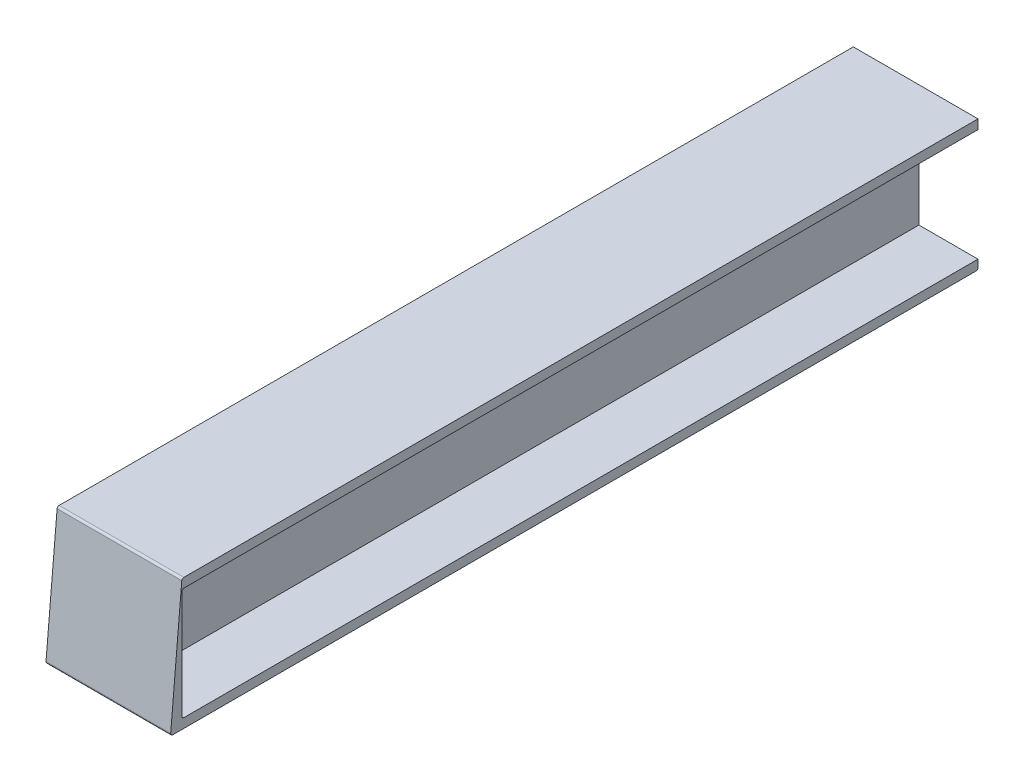
ISO-10303-21;
HEADER;
FILE_DESCRIPTION(('STEP AP214'),'2;1');
FILE_NAME('part.step','',(''),(''),'','','');
FILE_SCHEMA(('AUTOMOTIVE_DESIGN { 1 0 10303 214 1 1 1 1 }'));
ENDSEC;
DATA;
#1=APPLICATION_CONTEXT('core data for automotive mechanical design processes');
#2=APPLICATION_PROTOCOL_DEFINITION('international standard','automotive_design',2000,#1);
#3=PRODUCT_CONTEXT('',#1,'mechanical');
#4=PRODUCT('Part','Part','',(#3));
#5=PRODUCT_RELATED_PRODUCT_CATEGORY('part','',(#4));
#6=PRODUCT_DEFINITION_FORMATION('','',#4);
#7=PRODUCT_DEFINITION_CONTEXT('part definition',#1,'design');
#8=PRODUCT_DEFINITION('design','',#6,#7);
#9=PRODUCT_DEFINITION_SHAPE('','',#8);
#10=(LENGTH_UNIT() NAMED_UNIT(*) SI_UNIT(.MILLI.,.METRE.));
#11=(NAMED_UNIT(*) PLANE_ANGLE_UNIT() SI_UNIT($,.RADIAN.));
#12=(NAMED_UNIT(*) SI_UNIT($,.STERADIAN.) SOLID_ANGLE_UNIT());
#13=UNCERTAINTY_MEASURE_WITH_UNIT(LENGTH_MEASURE(1.E-05),#10,'distance_accuracy_value','');
#14=(GEOMETRIC_REPRESENTATION_CONTEXT(3) GLOBAL_UNCERTAINTY_ASSIGNED_CONTEXT((#13)) GLOBAL_UNIT_ASSIGNED_CONTEXT((#10,
#11,#12)) REPRESENTATION_CONTEXT('',''));
#15=CARTESIAN_POINT('',(0.,0.,0.));
#16=DIRECTION('',(0.,0.,1.));
#17=DIRECTION('',(1.,0.,0.));
#18=AXIS2_PLACEMENT_3D('',#15,#16,#17);
#19=CARTESIAN_POINT('',(73.152,-11.5572405329581,900.));
#20=DIRECTION('',(0.,1.,0.));
#21=DIRECTION('',(-1.,0.,0.));
#22=AXIS2_PLACEMENT_3D('',#19,#20,#21);
#23=PLANE('',#22);
#24=DIRECTION('',(0.,0.,-1.));
#25=VECTOR('',#24,1.);
#26=CARTESIAN_POINT('',(73.152,-11.5572405329581,900.));
#27=LINE('',#26,#25);
#28=CARTESIAN_POINT('',(73.152,-11.5572405329581,897.46));
#29=VERTEX_POINT('',#28);
#30=CARTESIAN_POINT('',(73.152,-11.5572405329581,-86.0122870923226));
#31=VERTEX_POINT('',#30);
#32=EDGE_CURVE('E176',#29,#31,#27,.T.);
#33=ORIENTED_EDGE('',*,*,#32,.F.);
#34=DIRECTION('',(1.,0.,0.));
#35=VECTOR('',#34,1.);
#36=CARTESIAN_POINT('',(0.,-11.5572405329582,897.46));
#37=LINE('',#36,#35);
#38=CARTESIAN_POINT('',(0.,-11.5572405329582,897.46));
#39=VERTEX_POINT('',#38);
#40=EDGE_CURVE('E296',#29,#39,#37,.F.);
#41=ORIENTED_EDGE('',*,*,#40,.T.);
#42=DIRECTION('',(0.,0.,-1.));
#43=VECTOR('',#42,1.);
#44=CARTESIAN_POINT('',(0.,-11.5572405329582,900.));
#45=LINE('',#44,#43);
#46=CARTESIAN_POINT('',(0.,-11.5572405329582,-86.0122870923226));
#47=VERTEX_POINT('',#46);
#48=EDGE_CURVE('E254',#39,#47,#45,.T.);
#49=ORIENTED_EDGE('',*,*,#48,.T.);
#50=DIRECTION('',(-1.,0.,0.));
#51=VECTOR('',#50,1.);
#52=CARTESIAN_POINT('',(73.152,-11.5572405329581,-86.0122870923226));
#53=LINE('',#52,#51);
#54=EDGE_CURVE('E187',#31,#47,#53,.T.);
#55=ORIENTED_EDGE('',*,*,#54,.F.);
#56=EDGE_LOOP('',(#33,#41,#49,#55));
#57=FACE_BOUND('',#56,.T.);
#58=ADVANCED_FACE('F35',(#57),#23,.F.);
#59=CARTESIAN_POINT('',(73.152,-150.495240532958,900.));
#60=DIRECTION('',(1.,0.,0.));
#61=DIRECTION('',(0.,0.,-1.));
#62=AXIS2_PLACEMENT_3D('',#59,#60,#61);
#63=PLANE('',#62);
#64=DIRECTION('',(0.,-1.,0.));
#65=VECTOR('',#64,1.);
#66=CARTESIAN_POINT('',(73.152,-150.495240532958,900.));
#67=LINE('',#66,#65);
#68=CARTESIAN_POINT('',(73.152,-14.0972405329582,900.));
#69=VERTEX_POINT('',#68);
#70=CARTESIAN_POINT('',(73.152,-147.955240532958,900.));
#71=VERTEX_POINT('',#70);
#72=EDGE_CURVE('E230',#69,#71,#67,.T.);
#73=ORIENTED_EDGE('',*,*,#72,.F.);
#74=CARTESIAN_POINT('',(73.152,-14.0972405329581,897.46));
#75=DIRECTION('',(1.,0.,0.));
#76=DIRECTION('',(0.,0.,-1.));
#77=AXIS2_PLACEMENT_3D('',#74,#75,#76);
#78=CIRCLE('',#77,2.54);
#79=EDGE_CURVE('E294',#69,#29,#78,.F.);
#80=ORIENTED_EDGE('',*,*,#79,.T.);
#81=ORIENTED_EDGE('',*,*,#32,.T.);
#82=DIRECTION('',(0.,1.,0.));
#83=VECTOR('',#82,1.);
#84=CARTESIAN_POINT('',(73.152,-150.495240532958,-86.0122870923226));
#85=LINE('',#84,#83);
#86=CARTESIAN_POINT('',(73.152,-150.495240532958,-86.0122870923226));
#87=VERTEX_POINT('',#86);
#88=EDGE_CURVE('E180',#87,#31,#85,.T.);
#89=ORIENTED_EDGE('',*,*,#88,.F.);
#90=DIRECTION('',(0.,0.,-1.));
#91=VECTOR('',#90,1.);
#92=CARTESIAN_POINT('',(73.152,-150.495240532958,900.));
#93=LINE('',#92,#91);
#94=CARTESIAN_POINT('',(73.152,-150.495240532958,897.46));
#95=VERTEX_POINT('',#94);
#96=EDGE_CURVE('E166',#95,#87,#93,.T.);
#97=ORIENTED_EDGE('',*,*,#96,.F.);
#98=CARTESIAN_POINT('',(73.152,-147.955240532958,897.46));
#99=DIRECTION('',(1.,0.,0.));
#100=DIRECTION('',(0.,0.,-1.));
#101=AXIS2_PLACEMENT_3D('',#98,#99,#100);
#102=CIRCLE('',#101,2.54);
#103=EDGE_CURVE('E292',#95,#71,#102,.F.);
#104=ORIENTED_EDGE('',*,*,#103,.T.);
#105=EDGE_LOOP('',(#73,#80,#81,#89,#97,#104));
#106=FACE_BOUND('',#105,.T.);
#107=ADVANCED_FACE('F182',(#106),#63,.F.);
#108=CARTESIAN_POINT('',(0.,-150.495240532958,900.));
#109=DIRECTION('',(0.,-1.,0.));
#110=DIRECTION('',(1.,0.,0.));
#111=AXIS2_PLACEMENT_3D('',#108,#109,#110);
#112=PLANE('',#111);
#113=DIRECTION('',(0.,0.,-1.));
#114=VECTOR('',#113,1.);
#115=CARTESIAN_POINT('',(0.,-150.495240532958,900.));
#116=LINE('',#115,#114);
#117=CARTESIAN_POINT('',(0.,-150.495240532958,897.46));
#118=VERTEX_POINT('',#117);
#119=CARTESIAN_POINT('',(0.,-150.495240532958,-86.0122870923226));
#120=VERTEX_POINT('',#119);
#121=EDGE_CURVE('E177',#118,#120,#116,.T.);
#122=ORIENTED_EDGE('',*,*,#121,.F.);
#123=DIRECTION('',(-1.,0.,0.));
#124=VECTOR('',#123,1.);
#125=CARTESIAN_POINT('',(73.152,-150.495240532958,897.46));
#126=LINE('',#125,#124);
#127=EDGE_CURVE('E173',#118,#95,#126,.F.);
#128=ORIENTED_EDGE('',*,*,#127,.T.);
#129=ORIENTED_EDGE('',*,*,#96,.T.);
#130=DIRECTION('',(1.,0.,0.));
#131=VECTOR('',#130,1.);
#132=CARTESIAN_POINT('',(0.,-150.495240532958,-86.0122870923226));
#133=LINE('',#132,#131);
#134=EDGE_CURVE('E171',#120,#87,#133,.T.);
#135=ORIENTED_EDGE('',*,*,#134,.F.);
#136=EDGE_LOOP('',(#122,#128,#129,#135));
#137=FACE_BOUND('',#136,.T.);
#138=ADVANCED_FACE('F169',(#137),#112,.F.);
#139=CARTESIAN_POINT('',(0.,-162.052240532958,900.));
#140=DIRECTION('',(1.,0.,0.));
#141=DIRECTION('',(0.,1.,0.));
#142=AXIS2_PLACEMENT_3D('',#139,#140,#141);
#143=PLANE('',#142);
#144=DIRECTION('',(0.,1.,0.));
#145=VECTOR('',#144,1.);
#146=CARTESIAN_POINT('',(0.,-162.052240532958,-86.0122870923226));
#147=LINE('',#146,#145);
#148=CARTESIAN_POINT('',(0.,-159.512240532958,-86.0122870923226));
#149=VERTEX_POINT('',#148);
#150=EDGE_CURVE('E192',#149,#120,#147,.T.);
#151=ORIENTED_EDGE('',*,*,#150,.F.);
#152=CARTESIAN_POINT('',(0.,-159.512240532958,-83.4722870923226));
#153=DIRECTION('',(1.,0.,0.));
#154=DIRECTION('',(0.,1.,0.));
#155=AXIS2_PLACEMENT_3D('',#152,#153,#154);
#156=CIRCLE('',#155,2.54);
#157=CARTESIAN_POINT('',(0.,-162.052240532958,-83.4722870923226));
#158=VERTEX_POINT('',#157);
#159=EDGE_CURVE('E57',#149,#158,#156,.F.);
#160=ORIENTED_EDGE('',*,*,#159,.T.);
#161=DIRECTION('',(0.,0.,-1.));
#162=VECTOR('',#161,1.);
#163=CARTESIAN_POINT('',(0.,-162.052240532958,900.));
#164=LINE('',#163,#162);
#165=CARTESIAN_POINT('',(0.,-162.052240532958,911.405789308986));
#166=VERTEX_POINT('',#165);
#167=EDGE_CURVE('E250',#166,#158,#164,.T.);
#168=ORIENTED_EDGE('',*,*,#167,.F.);
#169=CARTESIAN_POINT('',(0.,-159.512240532958,911.405789308986));
#170=DIRECTION('',(1.,0.,0.));
#171=DIRECTION('',(0.,1.,0.));
#172=AXIS2_PLACEMENT_3D('',#169,#170,#171);
#173=CIRCLE('',#172,2.54);
#174=CARTESIAN_POINT('',(0.,-159.290864946379,913.936123842139));
#175=VERTEX_POINT('',#174);
#176=EDGE_CURVE('E276',#166,#175,#173,.F.);
#177=ORIENTED_EDGE('',*,*,#176,.T.);
#178=DIRECTION('',(0.,0.996194698091746,-0.0871557427476519));
#179=VECTOR('',#178,1.);
#180=CARTESIAN_POINT('',(1.94289029309402E-13,-0.000240532958325138,900.));
#181=LINE('',#180,#179);
#182=CARTESIAN_POINT('',(1.91504796583308E-13,-2.31886494637912,900.202853351149));
#183=VERTEX_POINT('',#182);
#184=EDGE_CURVE('E224',#175,#183,#181,.T.);
#185=ORIENTED_EDGE('',*,*,#184,.T.);
#186=CARTESIAN_POINT('',(1.94289029309402E-13,-2.54024053295815,897.672518817996));
#187=DIRECTION('',(1.,0.,0.));
#188=DIRECTION('',(0.,1.,0.));
#189=AXIS2_PLACEMENT_3D('',#186,#187,#188);
#190=CIRCLE('',#189,2.54);
#191=CARTESIAN_POINT('',(0.,-0.000240532958150197,897.672518817996));
#192=VERTEX_POINT('',#191);
#193=EDGE_CURVE('E278',#183,#192,#190,.F.);
#194=ORIENTED_EDGE('',*,*,#193,.T.);
#195=DIRECTION('',(0.,0.,-1.));
#196=VECTOR('',#195,1.);
#197=CARTESIAN_POINT('',(0.,-0.000240532958150197,900.));
#198=LINE('',#197,#196);
#199=CARTESIAN_POINT('',(0.,-0.000240532958150197,-86.0122870923226));
#200=VERTEX_POINT('',#199);
#201=EDGE_CURVE('E236',#192,#200,#198,.T.);
#202=ORIENTED_EDGE('',*,*,#201,.T.);
#203=DIRECTION('',(0.,1.,0.));
#204=VECTOR('',#203,1.);
#205=CARTESIAN_POINT('',(0.,-11.5572405329582,-86.0122870923226));
#206=LINE('',#205,#204);
#207=EDGE_CURVE('E218',#47,#200,#206,.T.);
#208=ORIENTED_EDGE('',*,*,#207,.F.);
#209=ORIENTED_EDGE('',*,*,#48,.F.);
#210=CARTESIAN_POINT('',(1.66533453693773E-13,-14.0972405329582,897.46));
#211=DIRECTION('',(1.,0.,0.));
#212=DIRECTION('',(0.,1.,0.));
#213=AXIS2_PLACEMENT_3D('',#210,#211,#212);
#214=CIRCLE('',#213,2.54);
#215=CARTESIAN_POINT('',(1.77361178247123E-13,-14.0972405329582,900.));
#216=VERTEX_POINT('',#215);
#217=EDGE_CURVE('E305',#39,#216,#214,.T.);
#218=ORIENTED_EDGE('',*,*,#217,.T.);
#219=DIRECTION('',(0.,1.,0.));
#220=VECTOR('',#219,1.);
#221=CARTESIAN_POINT('',(1.94289029309402E-13,-0.000240532958326622,900.));
#222=LINE('',#221,#220);
#223=CARTESIAN_POINT('',(0.,-147.955240532958,900.));
#224=VERTEX_POINT('',#223);
#225=EDGE_CURVE('E222',#224,#216,#222,.T.);
#226=ORIENTED_EDGE('',*,*,#225,.F.);
#227=CARTESIAN_POINT('',(0.,-147.955240532958,897.46));
#228=DIRECTION('',(1.,0.,0.));
#229=DIRECTION('',(0.,1.,0.));
#230=AXIS2_PLACEMENT_3D('',#227,#228,#229);
#231=CIRCLE('',#230,2.54);
#232=EDGE_CURVE('E307',#224,#118,#231,.T.);
#233=ORIENTED_EDGE('',*,*,#232,.T.);
#234=ORIENTED_EDGE('',*,*,#121,.T.);
#235=EDGE_LOOP('',(#151,#160,#168,#177,#185,#194,#202,#208,#209,#218,#226,#233,#234));
#236=FACE_BOUND('',#235,.T.);
#237=ADVANCED_FACE('F315',(#236),#143,.F.);
#238=CARTESIAN_POINT('',(154.432,-162.052240532958,900.));
#239=DIRECTION('',(0.,1.,0.));
#240=DIRECTION('',(-1.,0.,0.));
#241=AXIS2_PLACEMENT_3D('',#238,#239,#240);
#242=PLANE('',#241);
#243=ORIENTED_EDGE('',*,*,#167,.T.);
#244=DIRECTION('',(-1.,0.,0.));
#245=VECTOR('',#244,1.);
#246=CARTESIAN_POINT('',(154.432,-162.052240532958,-83.4722870923226));
#247=LINE('',#246,#245);
#248=CARTESIAN_POINT('',(154.432,-162.052240532958,-83.4722870923226));
#249=VERTEX_POINT('',#248);
#250=EDGE_CURVE('E43',#158,#249,#247,.F.);
#251=ORIENTED_EDGE('',*,*,#250,.T.);
#252=DIRECTION('',(0.,0.,-1.));
#253=VECTOR('',#252,1.);
#254=CARTESIAN_POINT('',(154.432,-162.052240532958,900.));
#255=LINE('',#254,#253);
#256=CARTESIAN_POINT('',(154.432,-162.052240532958,911.405789308986));
#257=VERTEX_POINT('',#256);
#258=EDGE_CURVE('E248',#257,#249,#255,.T.);
#259=ORIENTED_EDGE('',*,*,#258,.F.);
#260=DIRECTION('',(1.,0.,0.));
#261=VECTOR('',#260,1.);
#262=CARTESIAN_POINT('',(0.,-162.052240532958,911.405789308986));
#263=LINE('',#262,#261);
#264=EDGE_CURVE('E299',#257,#166,#263,.F.);
#265=ORIENTED_EDGE('',*,*,#264,.T.);
#266=EDGE_LOOP('',(#243,#251,#259,#265));
#267=FACE_BOUND('',#266,.T.);
#268=ADVANCED_FACE('F405',(#267),#242,.F.);
#269=CARTESIAN_POINT('',(81.28,-150.495240532958,900.));
#270=DIRECTION('',(0.,-1.,0.));
#271=DIRECTION('',(1.,0.,0.));
#272=AXIS2_PLACEMENT_3D('',#269,#270,#271);
#273=PLANE('',#272);
#274=DIRECTION('',(0.,0.,-1.));
#275=VECTOR('',#274,1.);
#276=CARTESIAN_POINT('',(81.28,-150.495240532958,900.));
#277=LINE('',#276,#275);
#278=CARTESIAN_POINT('',(81.28,-150.495240532958,897.46));
#279=VERTEX_POINT('',#278);
#280=CARTESIAN_POINT('',(81.28,-150.495240532958,-86.0122870923226));
#281=VERTEX_POINT('',#280);
#282=EDGE_CURVE('E244',#279,#281,#277,.T.);
#283=ORIENTED_EDGE('',*,*,#282,.F.);
#284=DIRECTION('',(-1.,0.,0.));
#285=VECTOR('',#284,1.);
#286=CARTESIAN_POINT('',(154.432,-150.495240532958,897.46));
#287=LINE('',#286,#285);
#288=CARTESIAN_POINT('',(154.432,-150.495240532958,897.46));
#289=VERTEX_POINT('',#288);
#290=EDGE_CURVE('E268',#279,#289,#287,.F.);
#291=ORIENTED_EDGE('',*,*,#290,.T.);
#292=DIRECTION('',(0.,0.,-1.));
#293=VECTOR('',#292,1.);
#294=CARTESIAN_POINT('',(154.432,-150.495240532958,900.));
#295=LINE('',#294,#293);
#296=CARTESIAN_POINT('',(154.432,-150.495240532958,-86.0122870923226));
#297=VERTEX_POINT('',#296);
#298=EDGE_CURVE('E246',#289,#297,#295,.T.);
#299=ORIENTED_EDGE('',*,*,#298,.T.);
#300=DIRECTION('',(1.,0.,0.));
#301=VECTOR('',#300,1.);
#302=CARTESIAN_POINT('',(81.28,-150.495240532958,-86.0122870923226));
#303=LINE('',#302,#301);
#304=EDGE_CURVE('E203',#281,#297,#303,.T.);
#305=ORIENTED_EDGE('',*,*,#304,.F.);
#306=EDGE_LOOP('',(#283,#291,#299,#305));
#307=FACE_BOUND('',#306,.T.);
#308=ADVANCED_FACE('F355',(#307),#273,.F.);
#309=CARTESIAN_POINT('',(81.28,-11.5572405329582,900.));
#310=DIRECTION('',(-1.,0.,0.));
#311=DIRECTION('',(0.,-1.,0.));
#312=AXIS2_PLACEMENT_3D('',#309,#310,#311);
#313=PLANE('',#312);
#314=DIRECTION('',(0.,0.,-1.));
#315=VECTOR('',#314,1.);
#316=CARTESIAN_POINT('',(81.28,-11.5572405329582,900.));
#317=LINE('',#316,#315);
#318=CARTESIAN_POINT('',(81.28,-11.5572405329582,897.46));
#319=VERTEX_POINT('',#318);
#320=CARTESIAN_POINT('',(81.28,-11.5572405329582,-86.0122870923226));
#321=VERTEX_POINT('',#320);
#322=EDGE_CURVE('E242',#319,#321,#317,.T.);
#323=ORIENTED_EDGE('',*,*,#322,.F.);
#324=CARTESIAN_POINT('',(81.28,-14.0972405329582,897.46));
#325=DIRECTION('',(-1.,0.,0.));
#326=DIRECTION('',(0.,-1.,0.));
#327=AXIS2_PLACEMENT_3D('',#324,#325,#326);
#328=CIRCLE('',#327,2.54);
#329=CARTESIAN_POINT('',(81.28,-14.0972405329582,900.));
#330=VERTEX_POINT('',#329);
#331=EDGE_CURVE('E266',#319,#330,#328,.F.);
#332=ORIENTED_EDGE('',*,*,#331,.T.);
#333=DIRECTION('',(0.,1.,0.));
#334=VECTOR('',#333,1.);
#335=CARTESIAN_POINT('',(81.28,-11.5572405329582,900.));
#336=LINE('',#335,#334);
#337=CARTESIAN_POINT('',(81.28,-147.955240532958,900.));
#338=VERTEX_POINT('',#337);
#339=EDGE_CURVE('E233',#338,#330,#336,.T.);
#340=ORIENTED_EDGE('',*,*,#339,.F.);
#341=CARTESIAN_POINT('',(81.28,-147.955240532958,897.46));
#342=DIRECTION('',(-1.,0.,0.));
#343=DIRECTION('',(0.,-1.,0.));
#344=AXIS2_PLACEMENT_3D('',#341,#342,#343);
#345=CIRCLE('',#344,2.54);
#346=EDGE_CURVE('E264',#338,#279,#345,.F.);
#347=ORIENTED_EDGE('',*,*,#346,.T.);
#348=ORIENTED_EDGE('',*,*,#282,.T.);
#349=DIRECTION('',(0.,-1.,0.));
#350=VECTOR('',#349,1.);
#351=CARTESIAN_POINT('',(81.28,-11.5572405329582,-86.0122870923226));
#352=LINE('',#351,#350);
#353=EDGE_CURVE('E206',#321,#281,#352,.T.);
#354=ORIENTED_EDGE('',*,*,#353,.F.);
#355=EDGE_LOOP('',(#323,#332,#340,#347,#348,#354));
#356=FACE_BOUND('',#355,.T.);
#357=ADVANCED_FACE('F349',(#356),#313,.F.);
#358=CARTESIAN_POINT('',(154.432,-11.5572405329581,900.));
#359=DIRECTION('',(0.,1.,0.));
#360=DIRECTION('',(-1.,0.,0.));
#361=AXIS2_PLACEMENT_3D('',#358,#359,#360);
#362=PLANE('',#361);
#363=DIRECTION('',(0.,0.,-1.));
#364=VECTOR('',#363,1.);
#365=CARTESIAN_POINT('',(154.432,-11.5572405329581,900.));
#366=LINE('',#365,#364);
#367=CARTESIAN_POINT('',(154.432,-11.5572405329581,897.46));
#368=VERTEX_POINT('',#367);
#369=CARTESIAN_POINT('',(154.432,-11.5572405329581,-86.0122870923226));
#370=VERTEX_POINT('',#369);
#371=EDGE_CURVE('E240',#368,#370,#366,.T.);
#372=ORIENTED_EDGE('',*,*,#371,.F.);
#373=DIRECTION('',(1.,0.,0.));
#374=VECTOR('',#373,1.);
#375=CARTESIAN_POINT('',(81.28,-11.5572405329582,897.46));
#376=LINE('',#375,#374);
#377=EDGE_CURVE('E262',#368,#319,#376,.F.);
#378=ORIENTED_EDGE('',*,*,#377,.T.);
#379=ORIENTED_EDGE('',*,*,#322,.T.);
#380=DIRECTION('',(-1.,0.,0.));
#381=VECTOR('',#380,1.);
#382=CARTESIAN_POINT('',(154.432,-11.5572405329581,-86.0122870923226));
#383=LINE('',#382,#381);
#384=EDGE_CURVE('E209',#370,#321,#383,.T.);
#385=ORIENTED_EDGE('',*,*,#384,.F.);
#386=EDGE_LOOP('',(#372,#378,#379,#385));
#387=FACE_BOUND('',#386,.T.);
#388=ADVANCED_FACE('F344',(#387),#362,.F.);
#389=CARTESIAN_POINT('',(154.432,-0.000240532958131285,900.));
#390=DIRECTION('',(-1.,0.,0.));
#391=DIRECTION('',(0.,0.,1.));
#392=AXIS2_PLACEMENT_3D('',#389,#390,#391);
#393=PLANE('',#392);
#394=ORIENTED_EDGE('',*,*,#258,.T.);
#395=CARTESIAN_POINT('',(154.432,-159.512240532958,-83.4722870923226));
#396=DIRECTION('',(-1.,0.,0.));
#397=DIRECTION('',(0.,0.,1.));
#398=AXIS2_PLACEMENT_3D('',#395,#396,#397);
#399=CIRCLE('',#398,2.54);
#400=CARTESIAN_POINT('',(154.432,-159.512240532958,-86.0122870923226));
#401=VERTEX_POINT('',#400);
#402=EDGE_CURVE('E11',#249,#401,#399,.F.);
#403=ORIENTED_EDGE('',*,*,#402,.T.);
#404=DIRECTION('',(0.,-1.,0.));
#405=VECTOR('',#404,1.);
#406=CARTESIAN_POINT('',(154.432,-150.495240532958,-86.0122870923226));
#407=LINE('',#406,#405);
#408=EDGE_CURVE('E199',#297,#401,#407,.T.);
#409=ORIENTED_EDGE('',*,*,#408,.F.);
#410=ORIENTED_EDGE('',*,*,#298,.F.);
#411=CARTESIAN_POINT('',(154.432,-147.955240532958,897.46));
#412=DIRECTION('',(-1.,0.,0.));
#413=DIRECTION('',(0.,0.,1.));
#414=AXIS2_PLACEMENT_3D('',#411,#412,#413);
#415=CIRCLE('',#414,2.54);
#416=CARTESIAN_POINT('',(154.432,-147.955240532958,900.));
#417=VERTEX_POINT('',#416);
#418=EDGE_CURVE('E303',#289,#417,#415,.T.);
#419=ORIENTED_EDGE('',*,*,#418,.T.);
#420=DIRECTION('',(0.,-1.,0.));
#421=VECTOR('',#420,1.);
#422=CARTESIAN_POINT('',(154.432,-0.000240532958131285,900.));
#423=LINE('',#422,#421);
#424=CARTESIAN_POINT('',(154.432,-14.0972405329581,900.));
#425=VERTEX_POINT('',#424);
#426=EDGE_CURVE('E194',#425,#417,#423,.T.);
#427=ORIENTED_EDGE('',*,*,#426,.F.);
#428=CARTESIAN_POINT('',(154.432,-14.0972405329581,897.46));
#429=DIRECTION('',(-1.,0.,0.));
#430=DIRECTION('',(0.,0.,1.));
#431=AXIS2_PLACEMENT_3D('',#428,#429,#430);
#432=CIRCLE('',#431,2.54);
#433=EDGE_CURVE('E301',#425,#368,#432,.T.);
#434=ORIENTED_EDGE('',*,*,#433,.T.);
#435=ORIENTED_EDGE('',*,*,#371,.T.);
#436=DIRECTION('',(0.,-1.,0.));
#437=VECTOR('',#436,1.);
#438=CARTESIAN_POINT('',(154.432,-0.000240532958131285,-86.0122870923226));
#439=LINE('',#438,#437);
#440=CARTESIAN_POINT('',(154.432,-0.000240532958131285,-86.0122870923226));
#441=VERTEX_POINT('',#440);
#442=EDGE_CURVE('E212',#441,#370,#439,.T.);
#443=ORIENTED_EDGE('',*,*,#442,.F.);
#444=DIRECTION('',(0.,0.,-1.));
#445=VECTOR('',#444,1.);
#446=CARTESIAN_POINT('',(154.432,-0.000240532958131285,900.));
#447=LINE('',#446,#445);
#448=CARTESIAN_POINT('',(154.432,-0.000240532958131285,897.672518817996));
#449=VERTEX_POINT('',#448);
#450=EDGE_CURVE('E238',#449,#441,#447,.T.);
#451=ORIENTED_EDGE('',*,*,#450,.F.);
#452=CARTESIAN_POINT('',(154.432,-2.54024053295813,897.672518817996));
#453=DIRECTION('',(-1.,0.,0.));
#454=DIRECTION('',(0.,0.,1.));
#455=AXIS2_PLACEMENT_3D('',#452,#453,#454);
#456=CIRCLE('',#455,2.54);
#457=CARTESIAN_POINT('',(154.432,-2.3188649463791,900.202853351149));
#458=VERTEX_POINT('',#457);
#459=EDGE_CURVE('E284',#449,#458,#456,.F.);
#460=ORIENTED_EDGE('',*,*,#459,.T.);
#461=DIRECTION('',(0.,-0.996194698091746,0.0871557427476519));
#462=VECTOR('',#461,1.);
#463=CARTESIAN_POINT('',(154.432,-0.000240532958131285,900.));
#464=LINE('',#463,#462);
#465=CARTESIAN_POINT('',(154.432,-159.290864946379,913.936123842139));
#466=VERTEX_POINT('',#465);
#467=EDGE_CURVE('E197',#458,#466,#464,.T.);
#468=ORIENTED_EDGE('',*,*,#467,.T.);
#469=CARTESIAN_POINT('',(154.432,-159.512240532958,911.405789308986));
#470=DIRECTION('',(-1.,0.,0.));
#471=DIRECTION('',(0.,0.,1.));
#472=AXIS2_PLACEMENT_3D('',#469,#470,#471);
#473=CIRCLE('',#472,2.54);
#474=EDGE_CURVE('E282',#466,#257,#473,.F.);
#475=ORIENTED_EDGE('',*,*,#474,.T.);
#476=EDGE_LOOP('',(#394,#403,#409,#410,#419,#427,#434,#435,#443,#451,#460,#468,#475));
#477=FACE_BOUND('',#476,.T.);
#478=ADVANCED_FACE('F339',(#477),#393,.F.);
#479=CARTESIAN_POINT('',(0.,-0.000240532958150197,900.));
#480=DIRECTION('',(0.,-1.,0.));
#481=DIRECTION('',(1.,0.,0.));
#482=AXIS2_PLACEMENT_3D('',#479,#480,#481);
#483=PLANE('',#482);
#484=ORIENTED_EDGE('',*,*,#201,.F.);
#485=DIRECTION('',(-1.,0.,0.));
#486=VECTOR('',#485,1.);
#487=CARTESIAN_POINT('',(154.432,-0.000240532958131285,897.672518817996));
#488=LINE('',#487,#486);
#489=EDGE_CURVE('E280',#192,#449,#488,.F.);
#490=ORIENTED_EDGE('',*,*,#489,.T.);
#491=ORIENTED_EDGE('',*,*,#450,.T.);
#492=DIRECTION('',(1.,0.,0.));
#493=VECTOR('',#492,1.);
#494=CARTESIAN_POINT('',(0.,-0.000240532958150197,-86.0122870923226));
#495=LINE('',#494,#493);
#496=EDGE_CURVE('E215',#200,#441,#495,.T.);
#497=ORIENTED_EDGE('',*,*,#496,.F.);
#498=EDGE_LOOP('',(#484,#490,#491,#497));
#499=FACE_BOUND('',#498,.T.);
#500=ADVANCED_FACE('F334',(#499),#483,.F.);
#501=CARTESIAN_POINT('',(-162.671012313574,-0.000240532958131285,900.));
#502=DIRECTION('',(0.,0.,1.));
#503=DIRECTION('',(1.,0.,0.));
#504=AXIS2_PLACEMENT_3D('',#501,#502,#503);
#505=PLANE('',#504);
#506=ORIENTED_EDGE('',*,*,#225,.T.);
#507=DIRECTION('',(1.,0.,0.));
#508=VECTOR('',#507,1.);
#509=CARTESIAN_POINT('',(73.152,-14.0972405329581,900.));
#510=LINE('',#509,#508);
#511=EDGE_CURVE('E289',#216,#69,#510,.T.);
#512=ORIENTED_EDGE('',*,*,#511,.T.);
#513=ORIENTED_EDGE('',*,*,#72,.T.);
#514=DIRECTION('',(-1.,0.,0.));
#515=VECTOR('',#514,1.);
#516=CARTESIAN_POINT('',(0.,-147.955240532958,900.));
#517=LINE('',#516,#515);
#518=EDGE_CURVE('E286',#71,#224,#517,.T.);
#519=ORIENTED_EDGE('',*,*,#518,.T.);
#520=EDGE_LOOP('',(#506,#512,#513,#519));
#521=FACE_BOUND('',#520,.T.);
#522=ADVANCED_FACE('F321',(#521),#505,.F.);
#523=ORIENTED_EDGE('',*,*,#339,.T.);
#524=DIRECTION('',(1.,0.,0.));
#525=VECTOR('',#524,1.);
#526=CARTESIAN_POINT('',(154.432,-14.0972405329581,900.));
#527=LINE('',#526,#525);
#528=EDGE_CURVE('E259',#330,#425,#527,.T.);
#529=ORIENTED_EDGE('',*,*,#528,.T.);
#530=ORIENTED_EDGE('',*,*,#426,.T.);
#531=DIRECTION('',(-1.,0.,0.));
#532=VECTOR('',#531,1.);
#533=CARTESIAN_POINT('',(81.28,-147.955240532958,900.));
#534=LINE('',#533,#532);
#535=EDGE_CURVE('E256',#417,#338,#534,.T.);
#536=ORIENTED_EDGE('',*,*,#535,.T.);
#537=EDGE_LOOP('',(#523,#529,#530,#536));
#538=FACE_BOUND('',#537,.T.);
#539=ADVANCED_FACE('F466',(#538),#505,.F.);
#540=CARTESIAN_POINT('',(-162.671012313574,-0.000240532958131285,900.));
#541=DIRECTION('',(0.,0.0871557427476519,0.996194698091746));
#542=DIRECTION('',(0.,-0.996194698091746,0.0871557427476519));
#543=AXIS2_PLACEMENT_3D('',#540,#541,#542);
#544=PLANE('',#543);
#545=ORIENTED_EDGE('',*,*,#467,.F.);
#546=DIRECTION('',(-1.,0.,0.));
#547=VECTOR('',#546,1.);
#548=CARTESIAN_POINT('',(0.,-2.31886494637912,900.202853351149));
#549=LINE('',#548,#547);
#550=EDGE_CURVE('E273',#458,#183,#549,.T.);
#551=ORIENTED_EDGE('',*,*,#550,.T.);
#552=ORIENTED_EDGE('',*,*,#184,.F.);
#553=DIRECTION('',(1.,0.,0.));
#554=VECTOR('',#553,1.);
#555=CARTESIAN_POINT('',(154.432,-159.290864946379,913.936123842139));
#556=LINE('',#555,#554);
#557=EDGE_CURVE('E270',#175,#466,#556,.T.);
#558=ORIENTED_EDGE('',*,*,#557,.T.);
#559=EDGE_LOOP('',(#545,#551,#552,#558));
#560=FACE_BOUND('',#559,.T.);
#561=ADVANCED_FACE('F427',(#560),#544,.T.);
#562=CARTESIAN_POINT('',(-1690.9795863533,-8.89024053299584,-86.0122870923226));
#563=DIRECTION('',(0.,0.,-1.));
#564=DIRECTION('',(1.,0.,0.));
#565=AXIS2_PLACEMENT_3D('',#562,#563,#564);
#566=PLANE('',#565);
#567=ORIENTED_EDGE('',*,*,#408,.T.);
#568=DIRECTION('',(-1.,0.,0.));
#569=VECTOR('',#568,1.);
#570=CARTESIAN_POINT('',(0.,-159.512240532958,-86.0122870923226));
#571=LINE('',#570,#569);
#572=EDGE_CURVE('E309',#401,#149,#571,.T.);
#573=ORIENTED_EDGE('',*,*,#572,.T.);
#574=ORIENTED_EDGE('',*,*,#150,.T.);
#575=ORIENTED_EDGE('',*,*,#134,.T.);
#576=ORIENTED_EDGE('',*,*,#88,.T.);
#577=ORIENTED_EDGE('',*,*,#54,.T.);
#578=ORIENTED_EDGE('',*,*,#207,.T.);
#579=ORIENTED_EDGE('',*,*,#496,.T.);
#580=ORIENTED_EDGE('',*,*,#442,.T.);
#581=ORIENTED_EDGE('',*,*,#384,.T.);
#582=ORIENTED_EDGE('',*,*,#353,.T.);
#583=ORIENTED_EDGE('',*,*,#304,.T.);
#584=EDGE_LOOP('',(#567,#573,#574,#575,#576,#577,#578,#579,#580,#581,#582,#583));
#585=FACE_BOUND('',#584,.T.);
#586=ADVANCED_FACE('F190',(#585),#566,.T.);
#587=CARTESIAN_POINT('',(-162.671012313574,-14.0972405329582,897.46));
#588=DIRECTION('',(-1.,0.,0.));
#589=DIRECTION('',(0.,-1.,0.));
#590=AXIS2_PLACEMENT_3D('',#587,#588,#589);
#591=CYLINDRICAL_SURFACE('',#590,2.54);
#592=ORIENTED_EDGE('',*,*,#331,.F.);
#593=ORIENTED_EDGE('',*,*,#377,.F.);
#594=ORIENTED_EDGE('',*,*,#433,.F.);
#595=ORIENTED_EDGE('',*,*,#528,.F.);
#596=EDGE_LOOP('',(#592,#593,#594,#595));
#597=FACE_BOUND('',#596,.T.);
#598=ADVANCED_FACE('F373',(#597),#591,.F.);
#599=CARTESIAN_POINT('',(-162.671012313574,-147.955240532958,897.46));
#600=DIRECTION('',(1.,0.,0.));
#601=DIRECTION('',(0.,1.,0.));
#602=AXIS2_PLACEMENT_3D('',#599,#600,#601);
#603=CYLINDRICAL_SURFACE('',#602,2.54);
#604=ORIENTED_EDGE('',*,*,#418,.F.);
#605=ORIENTED_EDGE('',*,*,#290,.F.);
#606=ORIENTED_EDGE('',*,*,#346,.F.);
#607=ORIENTED_EDGE('',*,*,#535,.F.);
#608=EDGE_LOOP('',(#604,#605,#606,#607));
#609=FACE_BOUND('',#608,.T.);
#610=ADVANCED_FACE('F376',(#609),#603,.F.);
#611=CARTESIAN_POINT('',(-162.671012313574,-2.54024053295817,897.672518817996));
#612=DIRECTION('',(1.,0.,0.));
#613=DIRECTION('',(0.,1.,0.));
#614=AXIS2_PLACEMENT_3D('',#611,#612,#613);
#615=CYLINDRICAL_SURFACE('',#614,2.54);
#616=ORIENTED_EDGE('',*,*,#459,.F.);
#617=ORIENTED_EDGE('',*,*,#489,.F.);
#618=ORIENTED_EDGE('',*,*,#193,.F.);
#619=ORIENTED_EDGE('',*,*,#550,.F.);
#620=EDGE_LOOP('',(#616,#617,#618,#619));
#621=FACE_BOUND('',#620,.T.);
#622=ADVANCED_FACE('F380',(#621),#615,.T.);
#623=CARTESIAN_POINT('',(-162.671012313574,-14.0972405329582,897.46));
#624=DIRECTION('',(-1.,0.,0.));
#625=DIRECTION('',(0.,-1.,0.));
#626=AXIS2_PLACEMENT_3D('',#623,#624,#625);
#627=CYLINDRICAL_SURFACE('',#626,2.54);
#628=ORIENTED_EDGE('',*,*,#217,.F.);
#629=ORIENTED_EDGE('',*,*,#40,.F.);
#630=ORIENTED_EDGE('',*,*,#79,.F.);
#631=ORIENTED_EDGE('',*,*,#511,.F.);
#632=EDGE_LOOP('',(#628,#629,#630,#631));
#633=FACE_BOUND('',#632,.T.);
#634=ADVANCED_FACE('F325',(#633),#627,.F.);
#635=CARTESIAN_POINT('',(-162.671012313574,-147.955240532958,897.46));
#636=DIRECTION('',(1.,0.,0.));
#637=DIRECTION('',(0.,1.,0.));
#638=AXIS2_PLACEMENT_3D('',#635,#636,#637);
#639=CYLINDRICAL_SURFACE('',#638,2.54);
#640=ORIENTED_EDGE('',*,*,#103,.F.);
#641=ORIENTED_EDGE('',*,*,#127,.F.);
#642=ORIENTED_EDGE('',*,*,#232,.F.);
#643=ORIENTED_EDGE('',*,*,#518,.F.);
#644=EDGE_LOOP('',(#640,#641,#642,#643));
#645=FACE_BOUND('',#644,.T.);
#646=ADVANCED_FACE('F318',(#645),#639,.F.);
#647=CARTESIAN_POINT('',(-162.671012313574,-159.512240532958,911.405789308986));
#648=DIRECTION('',(-1.,0.,0.));
#649=DIRECTION('',(0.,-1.,0.));
#650=AXIS2_PLACEMENT_3D('',#647,#648,#649);
#651=CYLINDRICAL_SURFACE('',#650,2.54);
#652=ORIENTED_EDGE('',*,*,#176,.F.);
#653=ORIENTED_EDGE('',*,*,#264,.F.);
#654=ORIENTED_EDGE('',*,*,#474,.F.);
#655=ORIENTED_EDGE('',*,*,#557,.F.);
#656=EDGE_LOOP('',(#652,#653,#654,#655));
#657=FACE_BOUND('',#656,.T.);
#658=ADVANCED_FACE('F359',(#657),#651,.T.);
#659=CARTESIAN_POINT('',(-1690.9795863533,-159.512240532959,-83.4722870923226));
#660=DIRECTION('',(1.,0.,0.));
#661=DIRECTION('',(0.,1.,0.));
#662=AXIS2_PLACEMENT_3D('',#659,#660,#661);
#663=CYLINDRICAL_SURFACE('',#662,2.54);
#664=ORIENTED_EDGE('',*,*,#402,.F.);
#665=ORIENTED_EDGE('',*,*,#250,.F.);
#666=ORIENTED_EDGE('',*,*,#159,.F.);
#667=ORIENTED_EDGE('',*,*,#572,.F.);
#668=EDGE_LOOP('',(#664,#665,#666,#667));
#669=FACE_BOUND('',#668,.T.);
#670=ADVANCED_FACE('F37',(#669),#663,.T.);
#671=CLOSED_SHELL('',(#58,#107,#138,#237,#268,#308,#357,#388,#478,#500,#522,#539,#561,#586,#598,
#610,#622,#634,#646,#658,#670));
#672=MANIFOLD_SOLID_BREP('B2',#671);
#673=ADVANCED_BREP_SHAPE_REPRESENTATION('',(#18,#672),#14);
#674=SHAPE_DEFINITION_REPRESENTATION(#9,#673);
ENDSEC;
END-ISO-10303-21;
